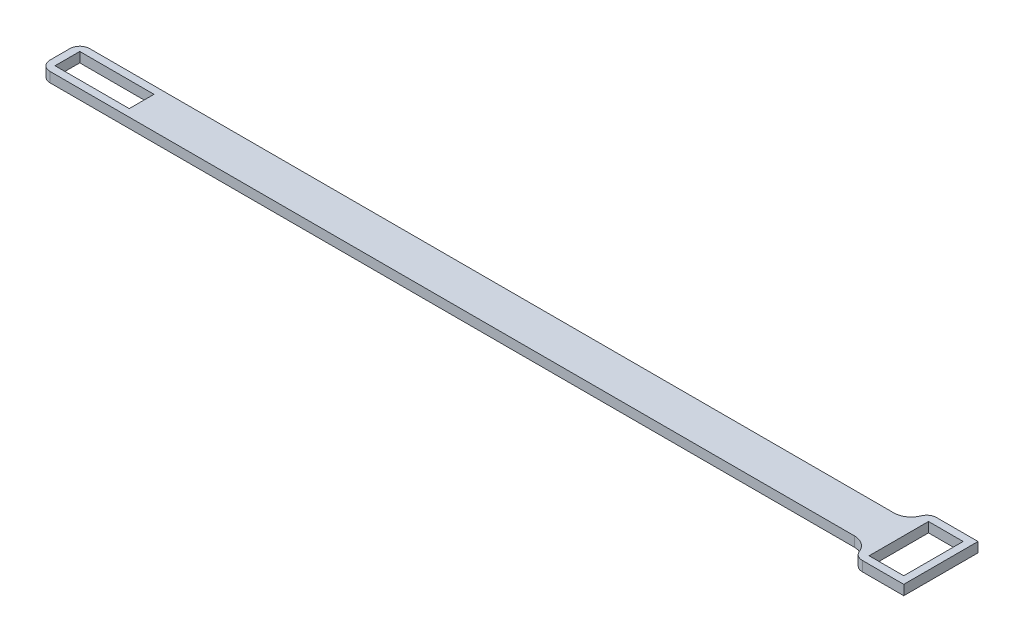
ISO-10303-21;
HEADER;
FILE_DESCRIPTION(('STEP AP214'),'2;1');
FILE_NAME('part.step','',(''),(''),'','','');
FILE_SCHEMA(('AUTOMOTIVE_DESIGN { 1 0 10303 214 1 1 1 1 }'));
ENDSEC;
DATA;
#1=APPLICATION_CONTEXT('core data for automotive mechanical design processes');
#2=APPLICATION_PROTOCOL_DEFINITION('international standard','automotive_design',2000,#1);
#3=PRODUCT_CONTEXT('',#1,'mechanical');
#4=PRODUCT('Part','Part','',(#3));
#5=PRODUCT_RELATED_PRODUCT_CATEGORY('part','',(#4));
#6=PRODUCT_DEFINITION_FORMATION('','',#4);
#7=PRODUCT_DEFINITION_CONTEXT('part definition',#1,'design');
#8=PRODUCT_DEFINITION('design','',#6,#7);
#9=PRODUCT_DEFINITION_SHAPE('','',#8);
#10=(LENGTH_UNIT() NAMED_UNIT(*) SI_UNIT(.MILLI.,.METRE.));
#11=(NAMED_UNIT(*) PLANE_ANGLE_UNIT() SI_UNIT($,.RADIAN.));
#12=(NAMED_UNIT(*) SI_UNIT($,.STERADIAN.) SOLID_ANGLE_UNIT());
#13=UNCERTAINTY_MEASURE_WITH_UNIT(LENGTH_MEASURE(1.E-05),#10,'distance_accuracy_value','');
#14=(GEOMETRIC_REPRESENTATION_CONTEXT(3) GLOBAL_UNCERTAINTY_ASSIGNED_CONTEXT((#13)) GLOBAL_UNIT_ASSIGNED_CONTEXT((#10,
#11,#12)) REPRESENTATION_CONTEXT('',''));
#15=CARTESIAN_POINT('',(0.,0.,0.));
#16=DIRECTION('',(0.,0.,1.));
#17=DIRECTION('',(1.,0.,0.));
#18=AXIS2_PLACEMENT_3D('',#15,#16,#17);
#19=CARTESIAN_POINT('',(0.,2.,-6.));
#20=DIRECTION('',(0.,0.,-1.));
#21=DIRECTION('',(-1.,0.,0.));
#22=AXIS2_PLACEMENT_3D('',#19,#20,#21);
#23=PLANE('',#22);
#24=DIRECTION('',(1.,0.,0.));
#25=VECTOR('',#24,1.);
#26=CARTESIAN_POINT('',(0.,0.,-6.));
#27=LINE('',#26,#25);
#28=CARTESIAN_POINT('',(76.5,0.,-6.));
#29=VERTEX_POINT('',#28);
#30=CARTESIAN_POINT('',(83.5,0.,-6.));
#31=VERTEX_POINT('',#30);
#32=EDGE_CURVE('E272',#29,#31,#27,.T.);
#33=ORIENTED_EDGE('',*,*,#32,.T.);
#34=DIRECTION('',(0.,-1.,0.));
#35=VECTOR('',#34,1.);
#36=CARTESIAN_POINT('',(83.5,2.,-6.));
#37=LINE('',#36,#35);
#38=CARTESIAN_POINT('',(83.5,2.,-6.));
#39=VERTEX_POINT('',#38);
#40=EDGE_CURVE('E291',#39,#31,#37,.T.);
#41=ORIENTED_EDGE('',*,*,#40,.F.);
#42=DIRECTION('',(1.,0.,0.));
#43=VECTOR('',#42,1.);
#44=CARTESIAN_POINT('',(0.,2.,-6.));
#45=LINE('',#44,#43);
#46=CARTESIAN_POINT('',(76.5,2.,-6.));
#47=VERTEX_POINT('',#46);
#48=EDGE_CURVE('E231',#47,#39,#45,.T.);
#49=ORIENTED_EDGE('',*,*,#48,.F.);
#50=DIRECTION('',(0.,-1.,0.));
#51=VECTOR('',#50,1.);
#52=CARTESIAN_POINT('',(76.5,2.,-6.));
#53=LINE('',#52,#51);
#54=EDGE_CURVE('E284',#47,#29,#53,.T.);
#55=ORIENTED_EDGE('',*,*,#54,.T.);
#56=EDGE_LOOP('',(#33,#41,#49,#55));
#57=FACE_BOUND('',#56,.T.);
#58=ADVANCED_FACE('F41',(#57),#23,.F.);
#59=CARTESIAN_POINT('',(83.5,2.,0.));
#60=DIRECTION('',(1.,0.,0.));
#61=DIRECTION('',(0.,0.,-1.));
#62=AXIS2_PLACEMENT_3D('',#59,#60,#61);
#63=PLANE('',#62);
#64=DIRECTION('',(0.,0.,1.));
#65=VECTOR('',#64,1.);
#66=CARTESIAN_POINT('',(83.5,0.,0.));
#67=LINE('',#66,#65);
#68=CARTESIAN_POINT('',(83.5,0.,6.));
#69=VERTEX_POINT('',#68);
#70=EDGE_CURVE('E275',#31,#69,#67,.T.);
#71=ORIENTED_EDGE('',*,*,#70,.T.);
#72=DIRECTION('',(0.,-1.,0.));
#73=VECTOR('',#72,1.);
#74=CARTESIAN_POINT('',(83.5,2.,6.));
#75=LINE('',#74,#73);
#76=CARTESIAN_POINT('',(83.5,2.,6.));
#77=VERTEX_POINT('',#76);
#78=EDGE_CURVE('E289',#77,#69,#75,.T.);
#79=ORIENTED_EDGE('',*,*,#78,.F.);
#80=DIRECTION('',(0.,0.,1.));
#81=VECTOR('',#80,1.);
#82=CARTESIAN_POINT('',(83.5,2.,0.));
#83=LINE('',#82,#81);
#84=EDGE_CURVE('E234',#39,#77,#83,.T.);
#85=ORIENTED_EDGE('',*,*,#84,.F.);
#86=ORIENTED_EDGE('',*,*,#40,.T.);
#87=EDGE_LOOP('',(#71,#79,#85,#86));
#88=FACE_BOUND('',#87,.T.);
#89=ADVANCED_FACE('F380',(#88),#63,.F.);
#90=CARTESIAN_POINT('',(0.,2.,6.));
#91=DIRECTION('',(0.,0.,-1.));
#92=DIRECTION('',(-1.,0.,0.));
#93=AXIS2_PLACEMENT_3D('',#90,#91,#92);
#94=PLANE('',#93);
#95=DIRECTION('',(1.,0.,0.));
#96=VECTOR('',#95,1.);
#97=CARTESIAN_POINT('',(0.,0.,6.));
#98=LINE('',#97,#96);
#99=CARTESIAN_POINT('',(76.5,0.,6.));
#100=VERTEX_POINT('',#99);
#101=EDGE_CURVE('E278',#100,#69,#98,.T.);
#102=ORIENTED_EDGE('',*,*,#101,.F.);
#103=DIRECTION('',(0.,-1.,0.));
#104=VECTOR('',#103,1.);
#105=CARTESIAN_POINT('',(76.5,2.,6.));
#106=LINE('',#105,#104);
#107=CARTESIAN_POINT('',(76.5,2.,6.));
#108=VERTEX_POINT('',#107);
#109=EDGE_CURVE('E286',#108,#100,#106,.T.);
#110=ORIENTED_EDGE('',*,*,#109,.F.);
#111=DIRECTION('',(1.,0.,0.));
#112=VECTOR('',#111,1.);
#113=CARTESIAN_POINT('',(0.,2.,6.));
#114=LINE('',#113,#112);
#115=EDGE_CURVE('E236',#108,#77,#114,.T.);
#116=ORIENTED_EDGE('',*,*,#115,.T.);
#117=ORIENTED_EDGE('',*,*,#78,.T.);
#118=EDGE_LOOP('',(#102,#110,#116,#117));
#119=FACE_BOUND('',#118,.T.);
#120=ADVANCED_FACE('F386',(#119),#94,.T.);
#121=CARTESIAN_POINT('',(-91.5,2.,0.));
#122=DIRECTION('',(1.,0.,0.));
#123=DIRECTION('',(0.,0.,-1.));
#124=AXIS2_PLACEMENT_3D('',#121,#122,#123);
#125=PLANE('',#124);
#126=DIRECTION('',(0.,0.,1.));
#127=VECTOR('',#126,1.);
#128=CARTESIAN_POINT('',(-91.5,0.,0.));
#129=LINE('',#128,#127);
#130=CARTESIAN_POINT('',(-91.5,0.,-2.50000000000006));
#131=VERTEX_POINT('',#130);
#132=CARTESIAN_POINT('',(-91.5,0.,2.49999999999994));
#133=VERTEX_POINT('',#132);
#134=EDGE_CURVE('E260',#131,#133,#129,.T.);
#135=ORIENTED_EDGE('',*,*,#134,.F.);
#136=DIRECTION('',(0.,-1.,0.));
#137=VECTOR('',#136,1.);
#138=CARTESIAN_POINT('',(-91.5,2.,-2.50000000000006));
#139=LINE('',#138,#137);
#140=CARTESIAN_POINT('',(-91.5,2.,-2.50000000000006));
#141=VERTEX_POINT('',#140);
#142=EDGE_CURVE('E287',#141,#131,#139,.T.);
#143=ORIENTED_EDGE('',*,*,#142,.F.);
#144=DIRECTION('',(0.,0.,1.));
#145=VECTOR('',#144,1.);
#146=CARTESIAN_POINT('',(-91.5,2.,0.));
#147=LINE('',#146,#145);
#148=CARTESIAN_POINT('',(-91.5,2.,2.49999999999994));
#149=VERTEX_POINT('',#148);
#150=EDGE_CURVE('E220',#141,#149,#147,.T.);
#151=ORIENTED_EDGE('',*,*,#150,.T.);
#152=DIRECTION('',(0.,-1.,0.));
#153=VECTOR('',#152,1.);
#154=CARTESIAN_POINT('',(-91.5,2.,2.49999999999994));
#155=LINE('',#154,#153);
#156=EDGE_CURVE('E200',#149,#133,#155,.T.);
#157=ORIENTED_EDGE('',*,*,#156,.T.);
#158=EDGE_LOOP('',(#135,#143,#151,#157));
#159=FACE_BOUND('',#158,.T.);
#160=ADVANCED_FACE('F402',(#159),#125,.T.);
#161=CARTESIAN_POINT('',(0.,2.,-2.50000000000003));
#162=DIRECTION('',(0.,0.,1.));
#163=DIRECTION('',(1.,0.,0.));
#164=AXIS2_PLACEMENT_3D('',#161,#162,#163);
#165=PLANE('',#164);
#166=DIRECTION('',(-1.,0.,0.));
#167=VECTOR('',#166,1.);
#168=CARTESIAN_POINT('',(0.,0.,-2.50000000000003));
#169=LINE('',#168,#167);
#170=CARTESIAN_POINT('',(-76.5,0.,-2.50000000000005));
#171=VERTEX_POINT('',#170);
#172=EDGE_CURVE('E263',#171,#131,#169,.T.);
#173=ORIENTED_EDGE('',*,*,#172,.F.);
#174=DIRECTION('',(0.,-1.,0.));
#175=VECTOR('',#174,1.);
#176=CARTESIAN_POINT('',(-76.5,2.,-2.50000000000005));
#177=LINE('',#176,#175);
#178=CARTESIAN_POINT('',(-76.5,2.,-2.50000000000005));
#179=VERTEX_POINT('',#178);
#180=EDGE_CURVE('E299',#179,#171,#177,.T.);
#181=ORIENTED_EDGE('',*,*,#180,.F.);
#182=DIRECTION('',(-1.,0.,0.));
#183=VECTOR('',#182,1.);
#184=CARTESIAN_POINT('',(0.,2.,-2.50000000000003));
#185=LINE('',#184,#183);
#186=EDGE_CURVE('E223',#179,#141,#185,.T.);
#187=ORIENTED_EDGE('',*,*,#186,.T.);
#188=ORIENTED_EDGE('',*,*,#142,.T.);
#189=EDGE_LOOP('',(#173,#181,#187,#188));
#190=FACE_BOUND('',#189,.T.);
#191=ADVANCED_FACE('F398',(#190),#165,.T.);
#192=CARTESIAN_POINT('',(-76.5,2.,0.));
#193=DIRECTION('',(1.,0.,0.));
#194=DIRECTION('',(0.,0.,-1.));
#195=AXIS2_PLACEMENT_3D('',#192,#193,#194);
#196=PLANE('',#195);
#197=DIRECTION('',(0.,0.,1.));
#198=VECTOR('',#197,1.);
#199=CARTESIAN_POINT('',(-76.5,0.,0.));
#200=LINE('',#199,#198);
#201=CARTESIAN_POINT('',(-76.5,0.,2.49999999999993));
#202=VERTEX_POINT('',#201);
#203=EDGE_CURVE('E266',#171,#202,#200,.T.);
#204=ORIENTED_EDGE('',*,*,#203,.T.);
#205=DIRECTION('',(0.,-1.,0.));
#206=VECTOR('',#205,1.);
#207=CARTESIAN_POINT('',(-76.5,2.,2.49999999999993));
#208=LINE('',#207,#206);
#209=CARTESIAN_POINT('',(-76.5,2.,2.49999999999993));
#210=VERTEX_POINT('',#209);
#211=EDGE_CURVE('E296',#210,#202,#208,.T.);
#212=ORIENTED_EDGE('',*,*,#211,.F.);
#213=DIRECTION('',(0.,0.,1.));
#214=VECTOR('',#213,1.);
#215=CARTESIAN_POINT('',(-76.5,2.,0.));
#216=LINE('',#215,#214);
#217=EDGE_CURVE('E226',#179,#210,#216,.T.);
#218=ORIENTED_EDGE('',*,*,#217,.F.);
#219=ORIENTED_EDGE('',*,*,#180,.T.);
#220=EDGE_LOOP('',(#204,#212,#218,#219));
#221=FACE_BOUND('',#220,.T.);
#222=ADVANCED_FACE('F395',(#221),#196,.F.);
#223=CARTESIAN_POINT('',(71.5,2.,7.5));
#224=DIRECTION('',(0.,-1.,0.));
#225=DIRECTION('',(0.,0.,-1.));
#226=AXIS2_PLACEMENT_3D('',#223,#224,#225);
#227=CYLINDRICAL_SURFACE('',#226,3.50000000000001);
#228=CARTESIAN_POINT('',(71.5,0.,7.5));
#229=DIRECTION('',(0.,1.,0.));
#230=DIRECTION('',(0.,0.,1.));
#231=AXIS2_PLACEMENT_3D('',#228,#229,#230);
#232=CIRCLE('',#231,3.50000000000001);
#233=CARTESIAN_POINT('',(74.7603934255326,0.,6.22727272727273));
#234=VERTEX_POINT('',#233);
#235=CARTESIAN_POINT('',(71.5,0.,4.));
#236=VERTEX_POINT('',#235);
#237=EDGE_CURVE('E243',#234,#236,#232,.T.);
#238=ORIENTED_EDGE('',*,*,#237,.F.);
#239=DIRECTION('',(0.,-1.,0.));
#240=VECTOR('',#239,1.);
#241=CARTESIAN_POINT('',(74.7603934255326,2.,6.22727272727273));
#242=LINE('',#241,#240);
#243=CARTESIAN_POINT('',(74.7603934255326,2.,6.22727272727273));
#244=VERTEX_POINT('',#243);
#245=EDGE_CURVE('E317',#234,#244,#242,.F.);
#246=ORIENTED_EDGE('',*,*,#245,.T.);
#247=CARTESIAN_POINT('',(71.5,2.,7.5));
#248=DIRECTION('',(0.,1.,0.));
#249=DIRECTION('',(0.,0.,1.));
#250=AXIS2_PLACEMENT_3D('',#247,#248,#249);
#251=CIRCLE('',#250,3.50000000000001);
#252=CARTESIAN_POINT('',(71.5,2.,4.));
#253=VERTEX_POINT('',#252);
#254=EDGE_CURVE('E190',#244,#253,#251,.T.);
#255=ORIENTED_EDGE('',*,*,#254,.T.);
#256=DIRECTION('',(0.,-1.,0.));
#257=VECTOR('',#256,1.);
#258=CARTESIAN_POINT('',(71.5,2.,4.));
#259=LINE('',#258,#257);
#260=EDGE_CURVE('E242',#253,#236,#259,.T.);
#261=ORIENTED_EDGE('',*,*,#260,.T.);
#262=EDGE_LOOP('',(#238,#246,#255,#261));
#263=FACE_BOUND('',#262,.T.);
#264=ADVANCED_FACE('F354',(#263),#227,.F.);
#265=CARTESIAN_POINT('',(0.,2.,7.5));
#266=DIRECTION('',(0.,0.,-1.));
#267=DIRECTION('',(-1.,0.,0.));
#268=AXIS2_PLACEMENT_3D('',#265,#266,#267);
#269=PLANE('',#268);
#270=DIRECTION('',(1.,0.,0.));
#271=VECTOR('',#270,1.);
#272=CARTESIAN_POINT('',(0.,2.,7.5));
#273=LINE('',#272,#271);
#274=CARTESIAN_POINT('',(76.6234753829798,2.,7.5));
#275=VERTEX_POINT('',#274);
#276=CARTESIAN_POINT('',(85.,2.,7.5));
#277=VERTEX_POINT('',#276);
#278=EDGE_CURVE('E177',#275,#277,#273,.T.);
#279=ORIENTED_EDGE('',*,*,#278,.F.);
#280=DIRECTION('',(0.,1.,0.));
#281=VECTOR('',#280,1.);
#282=CARTESIAN_POINT('',(76.6234753829798,0.,7.5));
#283=LINE('',#282,#281);
#284=CARTESIAN_POINT('',(76.6234753829798,0.,7.5));
#285=VERTEX_POINT('',#284);
#286=EDGE_CURVE('E294',#275,#285,#283,.F.);
#287=ORIENTED_EDGE('',*,*,#286,.T.);
#288=DIRECTION('',(1.,0.,0.));
#289=VECTOR('',#288,1.);
#290=CARTESIAN_POINT('',(0.,0.,7.5));
#291=LINE('',#290,#289);
#292=CARTESIAN_POINT('',(85.,0.,7.5));
#293=VERTEX_POINT('',#292);
#294=EDGE_CURVE('E196',#285,#293,#291,.T.);
#295=ORIENTED_EDGE('',*,*,#294,.T.);
#296=DIRECTION('',(0.,-1.,0.));
#297=VECTOR('',#296,1.);
#298=CARTESIAN_POINT('',(85.,2.,7.5));
#299=LINE('',#298,#297);
#300=EDGE_CURVE('E193',#277,#293,#299,.T.);
#301=ORIENTED_EDGE('',*,*,#300,.F.);
#302=EDGE_LOOP('',(#279,#287,#295,#301));
#303=FACE_BOUND('',#302,.T.);
#304=ADVANCED_FACE('F194',(#303),#269,.F.);
#305=CARTESIAN_POINT('',(85.,2.,0.));
#306=DIRECTION('',(1.,0.,0.));
#307=DIRECTION('',(0.,0.,-1.));
#308=AXIS2_PLACEMENT_3D('',#305,#306,#307);
#309=PLANE('',#308);
#310=DIRECTION('',(0.,0.,1.));
#311=VECTOR('',#310,1.);
#312=CARTESIAN_POINT('',(85.,0.,0.));
#313=LINE('',#312,#311);
#314=CARTESIAN_POINT('',(85.,0.,-7.5));
#315=VERTEX_POINT('',#314);
#316=EDGE_CURVE('E247',#315,#293,#313,.T.);
#317=ORIENTED_EDGE('',*,*,#316,.F.);
#318=DIRECTION('',(0.,-1.,0.));
#319=VECTOR('',#318,1.);
#320=CARTESIAN_POINT('',(85.,2.,-7.5));
#321=LINE('',#320,#319);
#322=CARTESIAN_POINT('',(85.,2.,-7.5));
#323=VERTEX_POINT('',#322);
#324=EDGE_CURVE('E201',#323,#315,#321,.T.);
#325=ORIENTED_EDGE('',*,*,#324,.F.);
#326=DIRECTION('',(0.,0.,1.));
#327=VECTOR('',#326,1.);
#328=CARTESIAN_POINT('',(85.,2.,0.));
#329=LINE('',#328,#327);
#330=EDGE_CURVE('E184',#323,#277,#329,.T.);
#331=ORIENTED_EDGE('',*,*,#330,.T.);
#332=ORIENTED_EDGE('',*,*,#300,.T.);
#333=EDGE_LOOP('',(#317,#325,#331,#332));
#334=FACE_BOUND('',#333,.T.);
#335=ADVANCED_FACE('F204',(#334),#309,.T.);
#336=CARTESIAN_POINT('',(0.,2.,-7.5));
#337=DIRECTION('',(0.,0.,-1.));
#338=DIRECTION('',(-1.,0.,0.));
#339=AXIS2_PLACEMENT_3D('',#336,#337,#338);
#340=PLANE('',#339);
#341=DIRECTION('',(1.,0.,0.));
#342=VECTOR('',#341,1.);
#343=CARTESIAN_POINT('',(0.,0.,-7.5));
#344=LINE('',#343,#342);
#345=CARTESIAN_POINT('',(76.6234753829798,0.,-7.5));
#346=VERTEX_POINT('',#345);
#347=EDGE_CURVE('E249',#346,#315,#344,.T.);
#348=ORIENTED_EDGE('',*,*,#347,.F.);
#349=DIRECTION('',(0.,-1.,0.));
#350=VECTOR('',#349,1.);
#351=CARTESIAN_POINT('',(76.6234753829798,2.,-7.5));
#352=LINE('',#351,#350);
#353=CARTESIAN_POINT('',(76.6234753829798,2.,-7.5));
#354=VERTEX_POINT('',#353);
#355=EDGE_CURVE('E328',#346,#354,#352,.F.);
#356=ORIENTED_EDGE('',*,*,#355,.T.);
#357=DIRECTION('',(1.,0.,0.));
#358=VECTOR('',#357,1.);
#359=CARTESIAN_POINT('',(0.,2.,-7.5));
#360=LINE('',#359,#358);
#361=EDGE_CURVE('E206',#354,#323,#360,.T.);
#362=ORIENTED_EDGE('',*,*,#361,.T.);
#363=ORIENTED_EDGE('',*,*,#324,.T.);
#364=EDGE_LOOP('',(#348,#356,#362,#363));
#365=FACE_BOUND('',#364,.T.);
#366=ADVANCED_FACE('F361',(#365),#340,.T.);
#367=CARTESIAN_POINT('',(71.5,2.,-7.5));
#368=DIRECTION('',(0.,-1.,0.));
#369=DIRECTION('',(0.,0.,-1.));
#370=AXIS2_PLACEMENT_3D('',#367,#368,#369);
#371=CYLINDRICAL_SURFACE('',#370,3.50000000000001);
#372=CARTESIAN_POINT('',(71.5,2.,-7.5));
#373=DIRECTION('',(0.,1.,0.));
#374=DIRECTION('',(0.,0.,1.));
#375=AXIS2_PLACEMENT_3D('',#372,#373,#374);
#376=CIRCLE('',#375,3.50000000000001);
#377=CARTESIAN_POINT('',(71.5,2.,-4.));
#378=VERTEX_POINT('',#377);
#379=CARTESIAN_POINT('',(74.7603934255326,2.,-6.22727272727273));
#380=VERTEX_POINT('',#379);
#381=EDGE_CURVE('E208',#378,#380,#376,.T.);
#382=ORIENTED_EDGE('',*,*,#381,.T.);
#383=DIRECTION('',(0.,-1.,0.));
#384=VECTOR('',#383,1.);
#385=CARTESIAN_POINT('',(74.7603934255326,2.,-6.22727272727273));
#386=LINE('',#385,#384);
#387=CARTESIAN_POINT('',(74.7603934255326,0.,-6.22727272727273));
#388=VERTEX_POINT('',#387);
#389=EDGE_CURVE('E325',#380,#388,#386,.T.);
#390=ORIENTED_EDGE('',*,*,#389,.T.);
#391=CARTESIAN_POINT('',(71.5,0.,-7.5));
#392=DIRECTION('',(0.,1.,0.));
#393=DIRECTION('',(0.,0.,1.));
#394=AXIS2_PLACEMENT_3D('',#391,#392,#393);
#395=CIRCLE('',#394,3.50000000000001);
#396=CARTESIAN_POINT('',(71.5,0.,-4.));
#397=VERTEX_POINT('',#396);
#398=EDGE_CURVE('E251',#397,#388,#395,.T.);
#399=ORIENTED_EDGE('',*,*,#398,.F.);
#400=DIRECTION('',(0.,-1.,0.));
#401=VECTOR('',#400,1.);
#402=CARTESIAN_POINT('',(71.5,2.,-4.));
#403=LINE('',#402,#401);
#404=EDGE_CURVE('E304',#378,#397,#403,.T.);
#405=ORIENTED_EDGE('',*,*,#404,.F.);
#406=EDGE_LOOP('',(#382,#390,#399,#405));
#407=FACE_BOUND('',#406,.T.);
#408=ADVANCED_FACE('F369',(#407),#371,.F.);
#409=CARTESIAN_POINT('',(0.,2.,-3.99999999999995));
#410=DIRECTION('',(0.,0.,-1.));
#411=DIRECTION('',(-1.,0.,0.));
#412=AXIS2_PLACEMENT_3D('',#409,#410,#411);
#413=PLANE('',#412);
#414=DIRECTION('',(1.,0.,0.));
#415=VECTOR('',#414,1.);
#416=CARTESIAN_POINT('',(0.,0.,-3.99999999999995));
#417=LINE('',#416,#415);
#418=CARTESIAN_POINT('',(-91.,0.,-3.99999999999994));
#419=VERTEX_POINT('',#418);
#420=EDGE_CURVE('E254',#419,#397,#417,.T.);
#421=ORIENTED_EDGE('',*,*,#420,.F.);
#422=DIRECTION('',(0.,-1.,0.));
#423=VECTOR('',#422,1.);
#424=CARTESIAN_POINT('',(-91.,2.,-3.99999999999994));
#425=LINE('',#424,#423);
#426=CARTESIAN_POINT('',(-91.,2.,-3.99999999999994));
#427=VERTEX_POINT('',#426);
#428=EDGE_CURVE('E11',#419,#427,#425,.F.);
#429=ORIENTED_EDGE('',*,*,#428,.T.);
#430=DIRECTION('',(1.,0.,0.));
#431=VECTOR('',#430,1.);
#432=CARTESIAN_POINT('',(0.,2.,-3.99999999999995));
#433=LINE('',#432,#431);
#434=EDGE_CURVE('E214',#427,#378,#433,.T.);
#435=ORIENTED_EDGE('',*,*,#434,.T.);
#436=ORIENTED_EDGE('',*,*,#404,.T.);
#437=EDGE_LOOP('',(#421,#429,#435,#436));
#438=FACE_BOUND('',#437,.T.);
#439=ADVANCED_FACE('F373',(#438),#413,.T.);
#440=CARTESIAN_POINT('',(-93.,2.,0.));
#441=DIRECTION('',(1.,0.,0.));
#442=DIRECTION('',(0.,0.,-1.));
#443=AXIS2_PLACEMENT_3D('',#440,#441,#442);
#444=PLANE('',#443);
#445=DIRECTION('',(0.,0.,1.));
#446=VECTOR('',#445,1.);
#447=CARTESIAN_POINT('',(-93.,0.,0.));
#448=LINE('',#447,#446);
#449=CARTESIAN_POINT('',(-93.,0.,-1.99999999999993));
#450=VERTEX_POINT('',#449);
#451=CARTESIAN_POINT('',(-93.,0.,1.99999999999993));
#452=VERTEX_POINT('',#451);
#453=EDGE_CURVE('E256',#450,#452,#448,.T.);
#454=ORIENTED_EDGE('',*,*,#453,.T.);
#455=DIRECTION('',(0.,-1.,0.));
#456=VECTOR('',#455,1.);
#457=CARTESIAN_POINT('',(-93.,2.,1.99999999999993));
#458=LINE('',#457,#456);
#459=CARTESIAN_POINT('',(-93.,2.,1.99999999999993));
#460=VERTEX_POINT('',#459);
#461=EDGE_CURVE('E49',#452,#460,#458,.F.);
#462=ORIENTED_EDGE('',*,*,#461,.T.);
#463=DIRECTION('',(0.,0.,1.));
#464=VECTOR('',#463,1.);
#465=CARTESIAN_POINT('',(-93.,2.,0.));
#466=LINE('',#465,#464);
#467=CARTESIAN_POINT('',(-93.,2.,-1.99999999999993));
#468=VERTEX_POINT('',#467);
#469=EDGE_CURVE('E216',#468,#460,#466,.T.);
#470=ORIENTED_EDGE('',*,*,#469,.F.);
#471=DIRECTION('',(0.,-1.,0.));
#472=VECTOR('',#471,1.);
#473=CARTESIAN_POINT('',(-93.,0.,-1.99999999999993));
#474=LINE('',#473,#472);
#475=EDGE_CURVE('E333',#468,#450,#474,.T.);
#476=ORIENTED_EDGE('',*,*,#475,.T.);
#477=EDGE_LOOP('',(#454,#462,#470,#476));
#478=FACE_BOUND('',#477,.T.);
#479=ADVANCED_FACE('F337',(#478),#444,.F.);
#480=CARTESIAN_POINT('',(0.,2.,2.49999999999991));
#481=DIRECTION('',(0.,0.,1.));
#482=DIRECTION('',(1.,0.,0.));
#483=AXIS2_PLACEMENT_3D('',#480,#481,#482);
#484=PLANE('',#483);
#485=DIRECTION('',(-1.,0.,0.));
#486=VECTOR('',#485,1.);
#487=CARTESIAN_POINT('',(0.,0.,2.49999999999991));
#488=LINE('',#487,#486);
#489=EDGE_CURVE('E269',#202,#133,#488,.T.);
#490=ORIENTED_EDGE('',*,*,#489,.T.);
#491=ORIENTED_EDGE('',*,*,#156,.F.);
#492=DIRECTION('',(-1.,0.,0.));
#493=VECTOR('',#492,1.);
#494=CARTESIAN_POINT('',(0.,2.,2.49999999999991));
#495=LINE('',#494,#493);
#496=EDGE_CURVE('E229',#210,#149,#495,.T.);
#497=ORIENTED_EDGE('',*,*,#496,.F.);
#498=ORIENTED_EDGE('',*,*,#211,.T.);
#499=EDGE_LOOP('',(#490,#491,#497,#498));
#500=FACE_BOUND('',#499,.T.);
#501=ADVANCED_FACE('F391',(#500),#484,.F.);
#502=CARTESIAN_POINT('',(0.,2.,3.99999999999995));
#503=DIRECTION('',(0.,0.,-1.));
#504=DIRECTION('',(-1.,0.,0.));
#505=AXIS2_PLACEMENT_3D('',#502,#503,#504);
#506=PLANE('',#505);
#507=DIRECTION('',(1.,0.,0.));
#508=VECTOR('',#507,1.);
#509=CARTESIAN_POINT('',(0.,2.,3.99999999999995));
#510=LINE('',#509,#508);
#511=CARTESIAN_POINT('',(-91.,2.,3.99999999999994));
#512=VERTEX_POINT('',#511);
#513=EDGE_CURVE('E218',#512,#253,#510,.T.);
#514=ORIENTED_EDGE('',*,*,#513,.F.);
#515=DIRECTION('',(0.,-1.,0.));
#516=VECTOR('',#515,1.);
#517=CARTESIAN_POINT('',(-91.,2.,3.99999999999994));
#518=LINE('',#517,#516);
#519=CARTESIAN_POINT('',(-91.,0.,3.99999999999994));
#520=VERTEX_POINT('',#519);
#521=EDGE_CURVE('E330',#512,#520,#518,.T.);
#522=ORIENTED_EDGE('',*,*,#521,.T.);
#523=DIRECTION('',(1.,0.,0.));
#524=VECTOR('',#523,1.);
#525=CARTESIAN_POINT('',(0.,0.,3.99999999999995));
#526=LINE('',#525,#524);
#527=EDGE_CURVE('E258',#520,#236,#526,.T.);
#528=ORIENTED_EDGE('',*,*,#527,.T.);
#529=ORIENTED_EDGE('',*,*,#260,.F.);
#530=EDGE_LOOP('',(#514,#522,#528,#529));
#531=FACE_BOUND('',#530,.T.);
#532=ADVANCED_FACE('F349',(#531),#506,.F.);
#533=CARTESIAN_POINT('',(76.5,2.,0.));
#534=DIRECTION('',(1.,0.,0.));
#535=DIRECTION('',(0.,0.,-1.));
#536=AXIS2_PLACEMENT_3D('',#533,#534,#535);
#537=PLANE('',#536);
#538=DIRECTION('',(0.,0.,1.));
#539=VECTOR('',#538,1.);
#540=CARTESIAN_POINT('',(76.5,0.,0.));
#541=LINE('',#540,#539);
#542=EDGE_CURVE('E281',#29,#100,#541,.T.);
#543=ORIENTED_EDGE('',*,*,#542,.F.);
#544=ORIENTED_EDGE('',*,*,#54,.F.);
#545=DIRECTION('',(0.,0.,1.));
#546=VECTOR('',#545,1.);
#547=CARTESIAN_POINT('',(76.5,2.,0.));
#548=LINE('',#547,#546);
#549=EDGE_CURVE('E239',#47,#108,#548,.T.);
#550=ORIENTED_EDGE('',*,*,#549,.T.);
#551=ORIENTED_EDGE('',*,*,#109,.T.);
#552=EDGE_LOOP('',(#543,#544,#550,#551));
#553=FACE_BOUND('',#552,.T.);
#554=ADVANCED_FACE('F409',(#553),#537,.T.);
#555=CARTESIAN_POINT('',(0.,2.,0.));
#556=DIRECTION('',(0.,1.,0.));
#557=DIRECTION('',(0.,0.,1.));
#558=AXIS2_PLACEMENT_3D('',#555,#556,#557);
#559=PLANE('',#558);
#560=ORIENTED_EDGE('',*,*,#254,.F.);
#561=CARTESIAN_POINT('',(76.6234753829798,2.,5.5));
#562=DIRECTION('',(0.,1.,0.));
#563=DIRECTION('',(0.,0.,1.));
#564=AXIS2_PLACEMENT_3D('',#561,#562,#563);
#565=CIRCLE('',#564,2.);
#566=EDGE_CURVE('E186',#244,#275,#565,.T.);
#567=ORIENTED_EDGE('',*,*,#566,.T.);
#568=ORIENTED_EDGE('',*,*,#278,.T.);
#569=ORIENTED_EDGE('',*,*,#330,.F.);
#570=ORIENTED_EDGE('',*,*,#361,.F.);
#571=CARTESIAN_POINT('',(76.6234753829798,2.,-5.5));
#572=DIRECTION('',(0.,1.,0.));
#573=DIRECTION('',(0.,0.,1.));
#574=AXIS2_PLACEMENT_3D('',#571,#572,#573);
#575=CIRCLE('',#574,2.);
#576=EDGE_CURVE('E322',#354,#380,#575,.T.);
#577=ORIENTED_EDGE('',*,*,#576,.T.);
#578=ORIENTED_EDGE('',*,*,#381,.F.);
#579=ORIENTED_EDGE('',*,*,#434,.F.);
#580=CARTESIAN_POINT('',(-91.,2.,-1.99999999999993));
#581=DIRECTION('',(0.,1.,0.));
#582=DIRECTION('',(0.,0.,1.));
#583=AXIS2_PLACEMENT_3D('',#580,#581,#582);
#584=CIRCLE('',#583,2.);
#585=EDGE_CURVE('E319',#427,#468,#584,.T.);
#586=ORIENTED_EDGE('',*,*,#585,.T.);
#587=ORIENTED_EDGE('',*,*,#469,.T.);
#588=CARTESIAN_POINT('',(-91.,2.,1.99999999999993));
#589=DIRECTION('',(0.,1.,0.));
#590=DIRECTION('',(0.,0.,1.));
#591=AXIS2_PLACEMENT_3D('',#588,#589,#590);
#592=CIRCLE('',#591,2.);
#593=EDGE_CURVE('E56',#460,#512,#592,.T.);
#594=ORIENTED_EDGE('',*,*,#593,.T.);
#595=ORIENTED_EDGE('',*,*,#513,.T.);
#596=EDGE_LOOP('',(#560,#567,#568,#569,#570,#577,#578,#579,#586,#587,#594,#595));
#597=FACE_BOUND('',#596,.T.);
#598=ORIENTED_EDGE('',*,*,#150,.F.);
#599=ORIENTED_EDGE('',*,*,#186,.F.);
#600=ORIENTED_EDGE('',*,*,#217,.T.);
#601=ORIENTED_EDGE('',*,*,#496,.T.);
#602=EDGE_LOOP('',(#598,#599,#600,#601));
#603=FACE_BOUND('',#602,.T.);
#604=ORIENTED_EDGE('',*,*,#48,.T.);
#605=ORIENTED_EDGE('',*,*,#84,.T.);
#606=ORIENTED_EDGE('',*,*,#115,.F.);
#607=ORIENTED_EDGE('',*,*,#549,.F.);
#608=EDGE_LOOP('',(#604,#605,#606,#607));
#609=FACE_BOUND('',#608,.T.);
#610=ADVANCED_FACE('F180',(#597,#603,#609),#559,.T.);
#611=CARTESIAN_POINT('',(0.,0.,0.));
#612=DIRECTION('',(0.,1.,0.));
#613=DIRECTION('',(0.,0.,1.));
#614=AXIS2_PLACEMENT_3D('',#611,#612,#613);
#615=PLANE('',#614);
#616=ORIENTED_EDGE('',*,*,#294,.F.);
#617=CARTESIAN_POINT('',(76.6234753829798,0.,5.5));
#618=DIRECTION('',(0.,1.,0.));
#619=DIRECTION('',(0.,0.,1.));
#620=AXIS2_PLACEMENT_3D('',#617,#618,#619);
#621=CIRCLE('',#620,2.);
#622=EDGE_CURVE('E315',#285,#234,#621,.F.);
#623=ORIENTED_EDGE('',*,*,#622,.T.);
#624=ORIENTED_EDGE('',*,*,#237,.T.);
#625=ORIENTED_EDGE('',*,*,#527,.F.);
#626=CARTESIAN_POINT('',(-91.,0.,1.99999999999993));
#627=DIRECTION('',(0.,1.,0.));
#628=DIRECTION('',(0.,0.,1.));
#629=AXIS2_PLACEMENT_3D('',#626,#627,#628);
#630=CIRCLE('',#629,2.);
#631=EDGE_CURVE('E311',#520,#452,#630,.F.);
#632=ORIENTED_EDGE('',*,*,#631,.T.);
#633=ORIENTED_EDGE('',*,*,#453,.F.);
#634=CARTESIAN_POINT('',(-91.,0.,-1.99999999999993));
#635=DIRECTION('',(0.,1.,0.));
#636=DIRECTION('',(0.,0.,1.));
#637=AXIS2_PLACEMENT_3D('',#634,#635,#636);
#638=CIRCLE('',#637,2.);
#639=EDGE_CURVE('E309',#450,#419,#638,.F.);
#640=ORIENTED_EDGE('',*,*,#639,.T.);
#641=ORIENTED_EDGE('',*,*,#420,.T.);
#642=ORIENTED_EDGE('',*,*,#398,.T.);
#643=CARTESIAN_POINT('',(76.6234753829798,0.,-5.5));
#644=DIRECTION('',(0.,1.,0.));
#645=DIRECTION('',(0.,0.,1.));
#646=AXIS2_PLACEMENT_3D('',#643,#644,#645);
#647=CIRCLE('',#646,2.);
#648=EDGE_CURVE('E313',#388,#346,#647,.F.);
#649=ORIENTED_EDGE('',*,*,#648,.T.);
#650=ORIENTED_EDGE('',*,*,#347,.T.);
#651=ORIENTED_EDGE('',*,*,#316,.T.);
#652=EDGE_LOOP('',(#616,#623,#624,#625,#632,#633,#640,#641,#642,#649,#650,#651));
#653=FACE_BOUND('',#652,.T.);
#654=ORIENTED_EDGE('',*,*,#134,.T.);
#655=ORIENTED_EDGE('',*,*,#489,.F.);
#656=ORIENTED_EDGE('',*,*,#203,.F.);
#657=ORIENTED_EDGE('',*,*,#172,.T.);
#658=EDGE_LOOP('',(#654,#655,#656,#657));
#659=FACE_BOUND('',#658,.T.);
#660=ORIENTED_EDGE('',*,*,#32,.F.);
#661=ORIENTED_EDGE('',*,*,#542,.T.);
#662=ORIENTED_EDGE('',*,*,#101,.T.);
#663=ORIENTED_EDGE('',*,*,#70,.F.);
#664=EDGE_LOOP('',(#660,#661,#662,#663));
#665=FACE_BOUND('',#664,.T.);
#666=ADVANCED_FACE('F341',(#653,#659,#665),#615,.F.);
#667=CARTESIAN_POINT('',(76.6234753829798,2.,5.5));
#668=DIRECTION('',(0.,-1.,0.));
#669=DIRECTION('',(0.,0.,-1.));
#670=AXIS2_PLACEMENT_3D('',#667,#668,#669);
#671=CYLINDRICAL_SURFACE('',#670,2.);
#672=ORIENTED_EDGE('',*,*,#566,.F.);
#673=ORIENTED_EDGE('',*,*,#245,.F.);
#674=ORIENTED_EDGE('',*,*,#622,.F.);
#675=ORIENTED_EDGE('',*,*,#286,.F.);
#676=EDGE_LOOP('',(#672,#673,#674,#675));
#677=FACE_BOUND('',#676,.T.);
#678=ADVANCED_FACE('F357',(#677),#671,.T.);
#679=CARTESIAN_POINT('',(76.6234753829798,2.,-5.5));
#680=DIRECTION('',(0.,-1.,0.));
#681=DIRECTION('',(0.,0.,-1.));
#682=AXIS2_PLACEMENT_3D('',#679,#680,#681);
#683=CYLINDRICAL_SURFACE('',#682,2.);
#684=ORIENTED_EDGE('',*,*,#576,.F.);
#685=ORIENTED_EDGE('',*,*,#355,.F.);
#686=ORIENTED_EDGE('',*,*,#648,.F.);
#687=ORIENTED_EDGE('',*,*,#389,.F.);
#688=EDGE_LOOP('',(#684,#685,#686,#687));
#689=FACE_BOUND('',#688,.T.);
#690=ADVANCED_FACE('F366',(#689),#683,.T.);
#691=CARTESIAN_POINT('',(-91.,2.,1.99999999999993));
#692=DIRECTION('',(0.,-1.,0.));
#693=DIRECTION('',(0.,0.,-1.));
#694=AXIS2_PLACEMENT_3D('',#691,#692,#693);
#695=CYLINDRICAL_SURFACE('',#694,2.);
#696=ORIENTED_EDGE('',*,*,#593,.F.);
#697=ORIENTED_EDGE('',*,*,#461,.F.);
#698=ORIENTED_EDGE('',*,*,#631,.F.);
#699=ORIENTED_EDGE('',*,*,#521,.F.);
#700=EDGE_LOOP('',(#696,#697,#698,#699));
#701=FACE_BOUND('',#700,.T.);
#702=ADVANCED_FACE('F347',(#701),#695,.T.);
#703=CARTESIAN_POINT('',(-91.,2.,-1.99999999999993));
#704=DIRECTION('',(0.,1.,0.));
#705=DIRECTION('',(0.,0.,1.));
#706=AXIS2_PLACEMENT_3D('',#703,#704,#705);
#707=CYLINDRICAL_SURFACE('',#706,2.);
#708=ORIENTED_EDGE('',*,*,#585,.F.);
#709=ORIENTED_EDGE('',*,*,#428,.F.);
#710=ORIENTED_EDGE('',*,*,#639,.F.);
#711=ORIENTED_EDGE('',*,*,#475,.F.);
#712=EDGE_LOOP('',(#708,#709,#710,#711));
#713=FACE_BOUND('',#712,.T.);
#714=ADVANCED_FACE('F43',(#713),#707,.T.);
#715=CLOSED_SHELL('',(#58,#89,#120,#160,#191,#222,#264,#304,#335,#366,#408,#439,#479,#501,#532,
#554,#610,#666,#678,#690,#702,#714));
#716=MANIFOLD_SOLID_BREP('B2',#715);
#717=ADVANCED_BREP_SHAPE_REPRESENTATION('',(#18,#716),#14);
#718=SHAPE_DEFINITION_REPRESENTATION(#9,#717);
ENDSEC;
END-ISO-10303-21;
